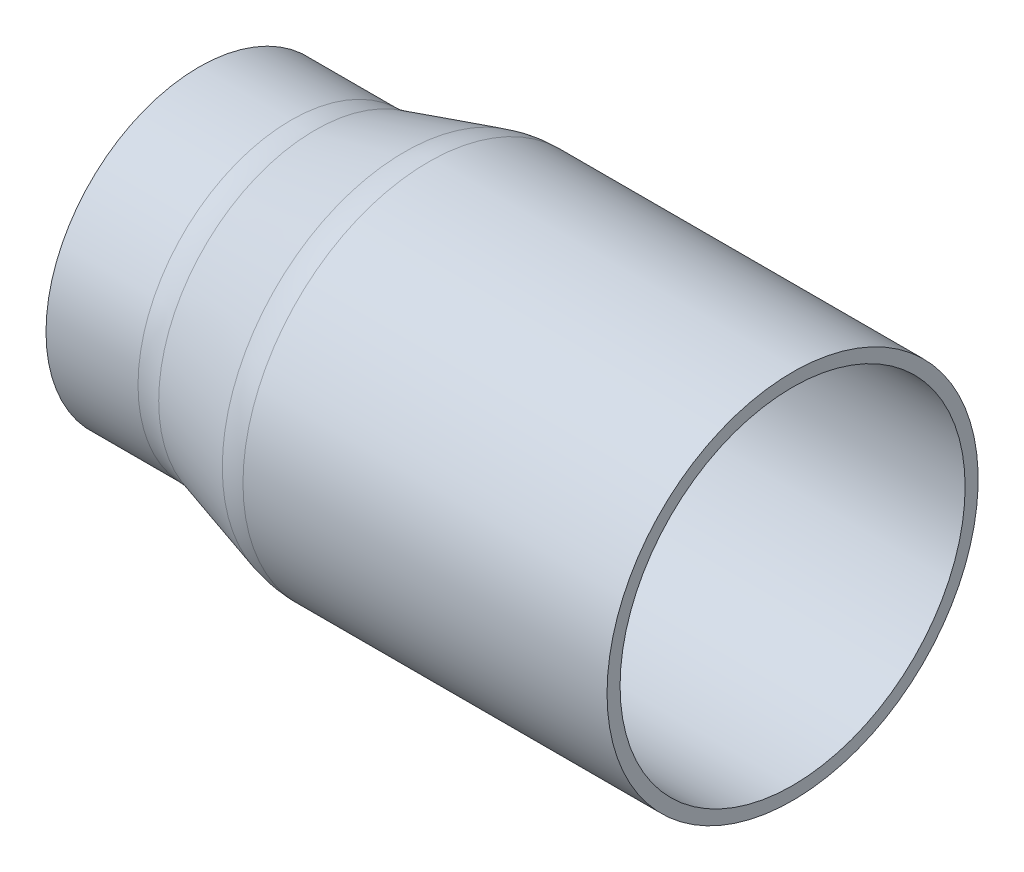
ISO-10303-21;
HEADER;
FILE_DESCRIPTION(('STEP AP214'),'2;1');
FILE_NAME('part.step','',(''),(''),'','','');
FILE_SCHEMA(('AUTOMOTIVE_DESIGN { 1 0 10303 214 1 1 1 1 }'));
ENDSEC;
DATA;
#1=APPLICATION_CONTEXT('core data for automotive mechanical design processes');
#2=APPLICATION_PROTOCOL_DEFINITION('international standard','automotive_design',2000,#1);
#3=PRODUCT_CONTEXT('',#1,'mechanical');
#4=PRODUCT('Part','Part','',(#3));
#5=PRODUCT_RELATED_PRODUCT_CATEGORY('part','',(#4));
#6=PRODUCT_DEFINITION_FORMATION('','',#4);
#7=PRODUCT_DEFINITION_CONTEXT('part definition',#1,'design');
#8=PRODUCT_DEFINITION('design','',#6,#7);
#9=PRODUCT_DEFINITION_SHAPE('','',#8);
#10=(LENGTH_UNIT() NAMED_UNIT(*) SI_UNIT(.MILLI.,.METRE.));
#11=(NAMED_UNIT(*) PLANE_ANGLE_UNIT() SI_UNIT($,.RADIAN.));
#12=(NAMED_UNIT(*) SI_UNIT($,.STERADIAN.) SOLID_ANGLE_UNIT());
#13=UNCERTAINTY_MEASURE_WITH_UNIT(LENGTH_MEASURE(1.E-05),#10,'distance_accuracy_value','');
#14=(GEOMETRIC_REPRESENTATION_CONTEXT(3) GLOBAL_UNCERTAINTY_ASSIGNED_CONTEXT((#13)) GLOBAL_UNIT_ASSIGNED_CONTEXT((#10,
#11,#12)) REPRESENTATION_CONTEXT('',''));
#15=CARTESIAN_POINT('',(0.,0.,0.));
#16=DIRECTION('',(0.,0.,1.));
#17=DIRECTION('',(1.,0.,0.));
#18=AXIS2_PLACEMENT_3D('',#15,#16,#17);
#19=CARTESIAN_POINT('',(-64.4530037543789,0.,-17.6));
#20=DIRECTION('',(1.,0.,0.));
#21=DIRECTION('',(0.,0.,-1.));
#22=AXIS2_PLACEMENT_3D('',#19,#20,#21);
#23=PLANE('',#22);
#24=CARTESIAN_POINT('',(-64.4530037543789,0.,0.));
#25=DIRECTION('',(-1.,0.,0.));
#26=DIRECTION('',(0.,0.,1.));
#27=AXIS2_PLACEMENT_3D('',#24,#25,#26);
#28=CIRCLE('',#27,16.1);
#29=CARTESIAN_POINT('',(-64.4530037543789,0.,16.1));
#30=VERTEX_POINT('',#29);
#31=EDGE_CURVE('E10',#30,#30,#28,.T.);
#32=ORIENTED_EDGE('',*,*,#31,.F.);
#33=EDGE_LOOP('',(#32));
#34=FACE_BOUND('',#33,.T.);
#35=CARTESIAN_POINT('',(-64.4530037543789,0.,0.));
#36=DIRECTION('',(-1.,0.,0.));
#37=DIRECTION('',(0.,0.,1.));
#38=AXIS2_PLACEMENT_3D('',#35,#36,#37);
#39=CIRCLE('',#38,17.6);
#40=CARTESIAN_POINT('',(-64.4530037543789,0.,17.6));
#41=VERTEX_POINT('',#40);
#42=EDGE_CURVE('E77',#41,#41,#39,.T.);
#43=ORIENTED_EDGE('',*,*,#42,.T.);
#44=EDGE_LOOP('',(#43));
#45=FACE_BOUND('',#44,.T.);
#46=ADVANCED_FACE('F37',(#34,#45),#23,.F.);
#47=CARTESIAN_POINT('',(-73.7294306832067,0.,0.));
#48=DIRECTION('',(-1.,0.,0.));
#49=DIRECTION('',(0.,0.,1.));
#50=AXIS2_PLACEMENT_3D('',#47,#48,#49);
#51=CYLINDRICAL_SURFACE('',#50,16.1);
#52=CARTESIAN_POINT('',(-53.8664947616717,0.,0.));
#53=DIRECTION('',(-1.,0.,0.));
#54=DIRECTION('',(0.,0.,1.));
#55=AXIS2_PLACEMENT_3D('',#52,#53,#54);
#56=CIRCLE('',#55,16.1);
#57=CARTESIAN_POINT('',(-53.8664947616717,0.,16.1));
#58=VERTEX_POINT('',#57);
#59=EDGE_CURVE('E43',#58,#58,#56,.T.);
#60=ORIENTED_EDGE('',*,*,#59,.F.);
#61=EDGE_LOOP('',(#60));
#62=FACE_BOUND('',#61,.T.);
#63=ORIENTED_EDGE('',*,*,#31,.T.);
#64=EDGE_LOOP('',(#63));
#65=FACE_BOUND('',#64,.T.);
#66=ADVANCED_FACE('F138',(#62,#65),#51,.F.);
#67=CARTESIAN_POINT('',(-53.8664947616717,0.,0.));
#68=DIRECTION('',(-1.,0.,0.));
#69=DIRECTION('',(0.,0.,1.));
#70=AXIS2_PLACEMENT_3D('',#67,#68,#69);
#71=TOROIDAL_SURFACE('',#70,26.1,10.);
#72=CARTESIAN_POINT('',(-51.0948882486499,0.,0.));
#73=DIRECTION('',(-1.,0.,0.));
#74=DIRECTION('',(0.,0.,1.));
#75=AXIS2_PLACEMENT_3D('',#72,#73,#74);
#76=CIRCLE('',#75,16.4917640881911);
#77=CARTESIAN_POINT('',(-51.0948882486499,0.,16.4917640881911));
#78=VERTEX_POINT('',#77);
#79=EDGE_CURVE('E47',#78,#78,#76,.T.);
#80=ORIENTED_EDGE('',*,*,#79,.F.);
#81=EDGE_LOOP('',(#80));
#82=FACE_BOUND('',#81,.T.);
#83=ORIENTED_EDGE('',*,*,#59,.T.);
#84=EDGE_LOOP('',(#83));
#85=FACE_BOUND('',#84,.T.);
#86=ADVANCED_FACE('F133',(#82,#85),#71,.T.);
#87=CARTESIAN_POINT('',(-51.0948882486499,0.,0.));
#88=DIRECTION('',(1.,0.,0.));
#89=DIRECTION('',(0.,0.,-1.));
#90=AXIS2_PLACEMENT_3D('',#87,#88,#89);
#91=CONICAL_SURFACE('',#90,16.4917640881911,0.280837724621203);
#92=CARTESIAN_POINT('',(-40.8111192601079,0.,0.));
#93=DIRECTION('',(-1.,0.,0.));
#94=DIRECTION('',(0.,0.,1.));
#95=AXIS2_PLACEMENT_3D('',#92,#93,#94);
#96=CIRCLE('',#95,19.4582359118089);
#97=CARTESIAN_POINT('',(-40.8111192601079,0.,19.4582359118089));
#98=VERTEX_POINT('',#97);
#99=EDGE_CURVE('E51',#98,#98,#96,.T.);
#100=ORIENTED_EDGE('',*,*,#99,.F.);
#101=EDGE_LOOP('',(#100));
#102=FACE_BOUND('',#101,.T.);
#103=ORIENTED_EDGE('',*,*,#79,.T.);
#104=EDGE_LOOP('',(#103));
#105=FACE_BOUND('',#104,.T.);
#106=ADVANCED_FACE('F127',(#102,#105),#91,.F.);
#107=CARTESIAN_POINT('',(-38.0395127470861,0.,0.));
#108=DIRECTION('',(-1.,0.,0.));
#109=DIRECTION('',(0.,0.,1.));
#110=AXIS2_PLACEMENT_3D('',#107,#108,#109);
#111=DEGENERATE_TOROIDAL_SURFACE('',#110,9.85,10.,.T.);
#112=CARTESIAN_POINT('',(-38.0395127470861,0.,0.));
#113=DIRECTION('',(-1.,0.,0.));
#114=DIRECTION('',(0.,0.,1.));
#115=AXIS2_PLACEMENT_3D('',#112,#113,#114);
#116=CIRCLE('',#115,19.85);
#117=CARTESIAN_POINT('',(-38.0395127470861,0.,19.85));
#118=VERTEX_POINT('',#117);
#119=EDGE_CURVE('E56',#118,#118,#116,.T.);
#120=ORIENTED_EDGE('',*,*,#119,.F.);
#121=EDGE_LOOP('',(#120));
#122=FACE_BOUND('',#121,.T.);
#123=ORIENTED_EDGE('',*,*,#99,.T.);
#124=EDGE_LOOP('',(#123));
#125=FACE_BOUND('',#124,.T.);
#126=ADVANCED_FACE('F121',(#122,#125),#111,.F.);
#127=CARTESIAN_POINT('',(-73.7294306832067,0.,0.));
#128=DIRECTION('',(-1.,0.,0.));
#129=DIRECTION('',(0.,0.,1.));
#130=AXIS2_PLACEMENT_3D('',#127,#128,#129);
#131=CYLINDRICAL_SURFACE('',#130,19.85);
#132=CARTESIAN_POINT('',(3.84699624562111,0.,0.));
#133=DIRECTION('',(-1.,0.,0.));
#134=DIRECTION('',(0.,0.,1.));
#135=AXIS2_PLACEMENT_3D('',#132,#133,#134);
#136=CIRCLE('',#135,19.85);
#137=CARTESIAN_POINT('',(3.84699624562111,0.,19.85));
#138=VERTEX_POINT('',#137);
#139=EDGE_CURVE('E59',#138,#138,#136,.T.);
#140=ORIENTED_EDGE('',*,*,#139,.F.);
#141=EDGE_LOOP('',(#140));
#142=FACE_BOUND('',#141,.T.);
#143=ORIENTED_EDGE('',*,*,#119,.T.);
#144=EDGE_LOOP('',(#143));
#145=FACE_BOUND('',#144,.T.);
#146=ADVANCED_FACE('F115',(#142,#145),#131,.F.);
#147=CARTESIAN_POINT('',(3.84699624562111,0.,-21.35));
#148=DIRECTION('',(-1.,0.,0.));
#149=DIRECTION('',(0.,0.,1.));
#150=AXIS2_PLACEMENT_3D('',#147,#148,#149);
#151=PLANE('',#150);
#152=CARTESIAN_POINT('',(3.84699624562111,0.,0.));
#153=DIRECTION('',(-1.,0.,0.));
#154=DIRECTION('',(0.,0.,1.));
#155=AXIS2_PLACEMENT_3D('',#152,#153,#154);
#156=CIRCLE('',#155,21.35);
#157=CARTESIAN_POINT('',(3.84699624562111,0.,21.35));
#158=VERTEX_POINT('',#157);
#159=EDGE_CURVE('E62',#158,#158,#156,.T.);
#160=ORIENTED_EDGE('',*,*,#159,.F.);
#161=EDGE_LOOP('',(#160));
#162=FACE_BOUND('',#161,.T.);
#163=ORIENTED_EDGE('',*,*,#139,.T.);
#164=EDGE_LOOP('',(#163));
#165=FACE_BOUND('',#164,.T.);
#166=ADVANCED_FACE('F109',(#162,#165),#151,.F.);
#167=CARTESIAN_POINT('',(-73.7294306832067,0.,0.));
#168=DIRECTION('',(-1.,0.,0.));
#169=DIRECTION('',(0.,0.,1.));
#170=AXIS2_PLACEMENT_3D('',#167,#168,#169);
#171=CYLINDRICAL_SURFACE('',#170,21.35);
#172=CARTESIAN_POINT('',(-38.039512747086,0.,0.));
#173=DIRECTION('',(-1.,0.,0.));
#174=DIRECTION('',(0.,0.,1.));
#175=AXIS2_PLACEMENT_3D('',#172,#173,#174);
#176=CIRCLE('',#175,21.35);
#177=CARTESIAN_POINT('',(-38.039512747086,0.,21.35));
#178=VERTEX_POINT('',#177);
#179=EDGE_CURVE('E65',#178,#178,#176,.T.);
#180=ORIENTED_EDGE('',*,*,#179,.F.);
#181=EDGE_LOOP('',(#180));
#182=FACE_BOUND('',#181,.T.);
#183=ORIENTED_EDGE('',*,*,#159,.T.);
#184=EDGE_LOOP('',(#183));
#185=FACE_BOUND('',#184,.T.);
#186=ADVANCED_FACE('F103',(#182,#185),#171,.T.);
#187=CARTESIAN_POINT('',(-38.0395127470861,0.,0.));
#188=DIRECTION('',(-1.,0.,0.));
#189=DIRECTION('',(0.,0.,1.));
#190=AXIS2_PLACEMENT_3D('',#187,#188,#189);
#191=TOROIDAL_SURFACE('',#190,11.35,10.);
#192=CARTESIAN_POINT('',(-40.8111192601079,0.,0.));
#193=DIRECTION('',(-1.,0.,0.));
#194=DIRECTION('',(0.,0.,1.));
#195=AXIS2_PLACEMENT_3D('',#192,#193,#194);
#196=CIRCLE('',#195,20.9582359118089);
#197=CARTESIAN_POINT('',(-40.8111192601079,0.,20.9582359118089));
#198=VERTEX_POINT('',#197);
#199=EDGE_CURVE('E68',#198,#198,#196,.T.);
#200=ORIENTED_EDGE('',*,*,#199,.F.);
#201=EDGE_LOOP('',(#200));
#202=FACE_BOUND('',#201,.T.);
#203=ORIENTED_EDGE('',*,*,#179,.T.);
#204=EDGE_LOOP('',(#203));
#205=FACE_BOUND('',#204,.T.);
#206=ADVANCED_FACE('F97',(#202,#205),#191,.T.);
#207=CARTESIAN_POINT('',(-40.8111192601079,0.,0.));
#208=DIRECTION('',(1.,0.,0.));
#209=DIRECTION('',(0.,0.,-1.));
#210=AXIS2_PLACEMENT_3D('',#207,#208,#209);
#211=CONICAL_SURFACE('',#210,20.9582359118089,0.280837724621202);
#212=CARTESIAN_POINT('',(-51.0948882486499,0.,0.));
#213=DIRECTION('',(-1.,0.,0.));
#214=DIRECTION('',(0.,0.,1.));
#215=AXIS2_PLACEMENT_3D('',#212,#213,#214);
#216=CIRCLE('',#215,17.9917640881911);
#217=CARTESIAN_POINT('',(-51.0948882486499,0.,17.9917640881911));
#218=VERTEX_POINT('',#217);
#219=EDGE_CURVE('E71',#218,#218,#216,.T.);
#220=ORIENTED_EDGE('',*,*,#219,.F.);
#221=EDGE_LOOP('',(#220));
#222=FACE_BOUND('',#221,.T.);
#223=ORIENTED_EDGE('',*,*,#199,.T.);
#224=EDGE_LOOP('',(#223));
#225=FACE_BOUND('',#224,.T.);
#226=ADVANCED_FACE('F91',(#222,#225),#211,.T.);
#227=CARTESIAN_POINT('',(-53.8664947616717,0.,0.));
#228=DIRECTION('',(-1.,0.,0.));
#229=DIRECTION('',(0.,0.,1.));
#230=AXIS2_PLACEMENT_3D('',#227,#228,#229);
#231=TOROIDAL_SURFACE('',#230,27.6,10.);
#232=CARTESIAN_POINT('',(-53.8664947616717,0.,0.));
#233=DIRECTION('',(-1.,0.,0.));
#234=DIRECTION('',(0.,0.,1.));
#235=AXIS2_PLACEMENT_3D('',#232,#233,#234);
#236=CIRCLE('',#235,17.6);
#237=CARTESIAN_POINT('',(-53.8664947616717,0.,17.6));
#238=VERTEX_POINT('',#237);
#239=EDGE_CURVE('E74',#238,#238,#236,.T.);
#240=ORIENTED_EDGE('',*,*,#239,.F.);
#241=EDGE_LOOP('',(#240));
#242=FACE_BOUND('',#241,.T.);
#243=ORIENTED_EDGE('',*,*,#219,.T.);
#244=EDGE_LOOP('',(#243));
#245=FACE_BOUND('',#244,.T.);
#246=ADVANCED_FACE('F85',(#242,#245),#231,.F.);
#247=CARTESIAN_POINT('',(-73.7294306832067,0.,0.));
#248=DIRECTION('',(-1.,0.,0.));
#249=DIRECTION('',(0.,0.,1.));
#250=AXIS2_PLACEMENT_3D('',#247,#248,#249);
#251=CYLINDRICAL_SURFACE('',#250,17.6);
#252=ORIENTED_EDGE('',*,*,#42,.F.);
#253=EDGE_LOOP('',(#252));
#254=FACE_BOUND('',#253,.T.);
#255=ORIENTED_EDGE('',*,*,#239,.T.);
#256=EDGE_LOOP('',(#255));
#257=FACE_BOUND('',#256,.T.);
#258=ADVANCED_FACE('F82',(#254,#257),#251,.T.);
#259=CLOSED_SHELL('',(#46,#66,#86,#106,#126,#146,#166,#186,#206,#226,#246,#258));
#260=MANIFOLD_SOLID_BREP('B2',#259);
#261=ADVANCED_BREP_SHAPE_REPRESENTATION('',(#18,#260),#14);
#262=SHAPE_DEFINITION_REPRESENTATION(#9,#261);
ENDSEC;
END-ISO-10303-21;
